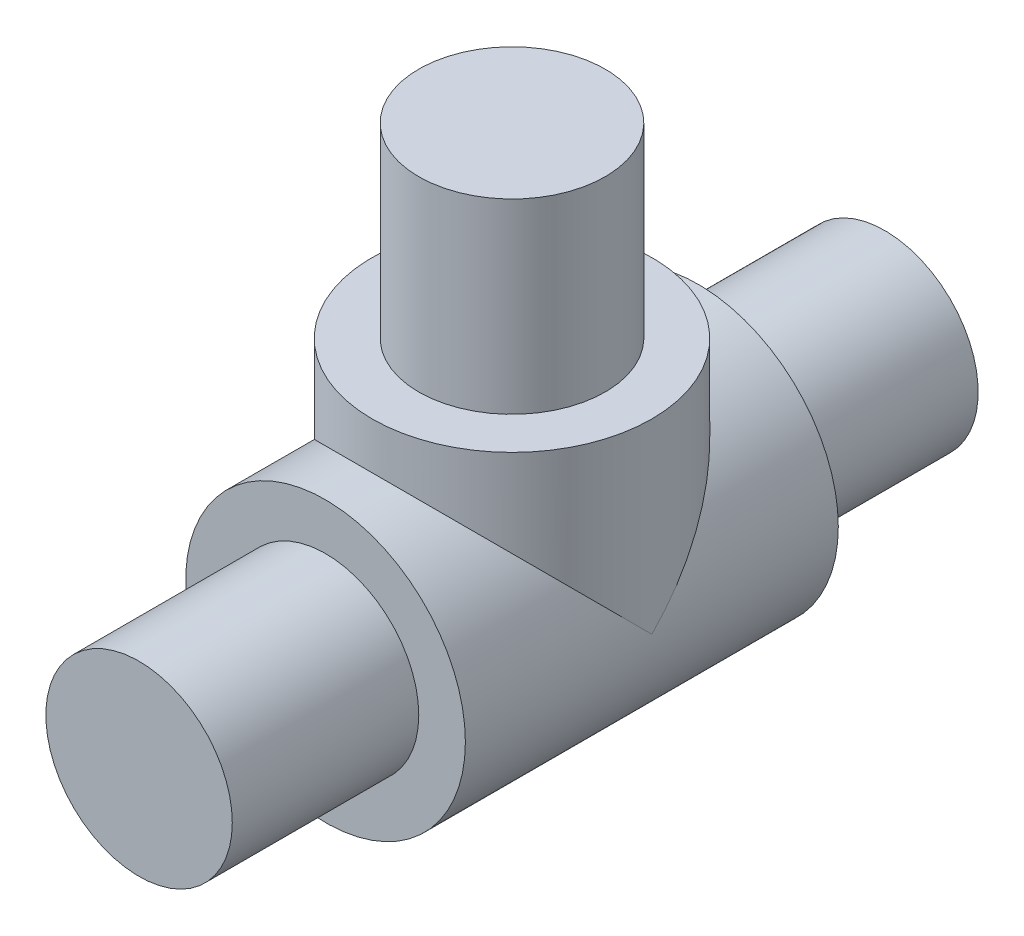
ISO-10303-21;
HEADER;
FILE_DESCRIPTION(('STEP AP214'),'2;1');
FILE_NAME('part.step','',(''),(''),'','','');
FILE_SCHEMA(('AUTOMOTIVE_DESIGN { 1 0 10303 214 1 1 1 1 }'));
ENDSEC;
DATA;
#1=APPLICATION_CONTEXT('core data for automotive mechanical design processes');
#2=APPLICATION_PROTOCOL_DEFINITION('international standard','automotive_design',2000,#1);
#3=PRODUCT_CONTEXT('',#1,'mechanical');
#4=PRODUCT('Part','Part','',(#3));
#5=PRODUCT_RELATED_PRODUCT_CATEGORY('part','',(#4));
#6=PRODUCT_DEFINITION_FORMATION('','',#4);
#7=PRODUCT_DEFINITION_CONTEXT('part definition',#1,'design');
#8=PRODUCT_DEFINITION('design','',#6,#7);
#9=PRODUCT_DEFINITION_SHAPE('','',#8);
#10=(LENGTH_UNIT() NAMED_UNIT(*) SI_UNIT(.MILLI.,.METRE.));
#11=(NAMED_UNIT(*) PLANE_ANGLE_UNIT() SI_UNIT($,.RADIAN.));
#12=(NAMED_UNIT(*) SI_UNIT($,.STERADIAN.) SOLID_ANGLE_UNIT());
#13=UNCERTAINTY_MEASURE_WITH_UNIT(LENGTH_MEASURE(1.E-05),#10,'distance_accuracy_value','');
#14=(GEOMETRIC_REPRESENTATION_CONTEXT(3) GLOBAL_UNCERTAINTY_ASSIGNED_CONTEXT((#13)) GLOBAL_UNIT_ASSIGNED_CONTEXT((#10,
#11,#12)) REPRESENTATION_CONTEXT('',''));
#15=CARTESIAN_POINT('',(0.,0.,0.));
#16=DIRECTION('',(0.,0.,1.));
#17=DIRECTION('',(1.,0.,0.));
#18=AXIS2_PLACEMENT_3D('',#15,#16,#17);
#19=CARTESIAN_POINT('',(0.,0.,10.16));
#20=DIRECTION('',(0.,0.,-1.));
#21=DIRECTION('',(-1.,0.,0.));
#22=AXIS2_PLACEMENT_3D('',#19,#20,#21);
#23=CYLINDRICAL_SURFACE('',#22,3.81);
#24=CARTESIAN_POINT('',(0.,0.,0.));
#25=DIRECTION('',(0.,0.,1.));
#26=DIRECTION('',(1.,0.,0.));
#27=AXIS2_PLACEMENT_3D('',#24,#25,#26);
#28=CIRCLE('',#27,3.81);
#29=CARTESIAN_POINT('',(3.81,0.,0.));
#30=VERTEX_POINT('',#29);
#31=EDGE_CURVE('E66',#30,#30,#28,.T.);
#32=ORIENTED_EDGE('',*,*,#31,.T.);
#33=EDGE_LOOP('',(#32));
#34=FACE_BOUND('',#33,.T.);
#35=CARTESIAN_POINT('',(0.,0.,10.16));
#36=DIRECTION('',(0.,0.,1.));
#37=DIRECTION('',(1.,0.,0.));
#38=AXIS2_PLACEMENT_3D('',#35,#36,#37);
#39=CIRCLE('',#38,3.81);
#40=CARTESIAN_POINT('',(3.81,0.,10.16));
#41=VERTEX_POINT('',#40);
#42=EDGE_CURVE('E70',#41,#41,#39,.T.);
#43=ORIENTED_EDGE('',*,*,#42,.F.);
#44=EDGE_LOOP('',(#43));
#45=FACE_BOUND('',#44,.T.);
#46=CARTESIAN_POINT('',(0.,0.,5.08));
#47=DIRECTION('',(0.,-0.707106781186547,-0.707106781186547));
#48=DIRECTION('',(0.,0.707106781186547,-0.707106781186547));
#49=AXIS2_PLACEMENT_3D('',#46,#47,#48);
#50=ELLIPSE('',#49,5.38815367264149,3.81);
#51=CARTESIAN_POINT('',(3.81,0.,5.08));
#52=VERTEX_POINT('',#51);
#53=CARTESIAN_POINT('',(-3.81,0.,5.08));
#54=VERTEX_POINT('',#53);
#55=EDGE_CURVE('E42',#52,#54,#50,.F.);
#56=ORIENTED_EDGE('',*,*,#55,.F.);
#57=CARTESIAN_POINT('',(0.,0.,5.08));
#58=DIRECTION('',(0.,0.707106781186547,-0.707106781186547));
#59=DIRECTION('',(0.,-0.707106781186547,-0.707106781186547));
#60=AXIS2_PLACEMENT_3D('',#57,#58,#59);
#61=ELLIPSE('',#60,5.38815367264149,3.81);
#62=EDGE_CURVE('E54',#54,#52,#61,.T.);
#63=ORIENTED_EDGE('',*,*,#62,.F.);
#64=EDGE_LOOP('',(#56,#63));
#65=FACE_BOUND('',#64,.T.);
#66=ADVANCED_FACE('F39',(#34,#45,#65),#23,.T.);
#67=CARTESIAN_POINT('',(0.,0.,10.16));
#68=DIRECTION('',(0.,0.,1.));
#69=DIRECTION('',(1.,0.,0.));
#70=AXIS2_PLACEMENT_3D('',#67,#68,#69);
#71=PLANE('',#70);
#72=CARTESIAN_POINT('',(0.,0.,10.16));
#73=DIRECTION('',(0.,0.,1.));
#74=DIRECTION('',(1.,0.,0.));
#75=AXIS2_PLACEMENT_3D('',#72,#73,#74);
#76=CIRCLE('',#75,2.54);
#77=CARTESIAN_POINT('',(2.54,0.,10.16));
#78=VERTEX_POINT('',#77);
#79=EDGE_CURVE('E63',#78,#78,#76,.T.);
#80=ORIENTED_EDGE('',*,*,#79,.F.);
#81=EDGE_LOOP('',(#80));
#82=FACE_BOUND('',#81,.T.);
#83=ORIENTED_EDGE('',*,*,#42,.T.);
#84=EDGE_LOOP('',(#83));
#85=FACE_BOUND('',#84,.T.);
#86=ADVANCED_FACE('F119',(#82,#85),#71,.T.);
#87=CARTESIAN_POINT('',(0.,0.,0.));
#88=DIRECTION('',(0.,0.,1.));
#89=DIRECTION('',(1.,0.,0.));
#90=AXIS2_PLACEMENT_3D('',#87,#88,#89);
#91=PLANE('',#90);
#92=CARTESIAN_POINT('',(0.,0.,0.));
#93=DIRECTION('',(0.,0.,-1.));
#94=DIRECTION('',(-1.,0.,0.));
#95=AXIS2_PLACEMENT_3D('',#92,#93,#94);
#96=CIRCLE('',#95,2.54);
#97=CARTESIAN_POINT('',(-2.54,0.,0.));
#98=VERTEX_POINT('',#97);
#99=EDGE_CURVE('E60',#98,#98,#96,.T.);
#100=ORIENTED_EDGE('',*,*,#99,.F.);
#101=EDGE_LOOP('',(#100));
#102=FACE_BOUND('',#101,.T.);
#103=ORIENTED_EDGE('',*,*,#31,.F.);
#104=EDGE_LOOP('',(#103));
#105=FACE_BOUND('',#104,.T.);
#106=ADVANCED_FACE('F125',(#102,#105),#91,.F.);
#107=CARTESIAN_POINT('',(0.,0.,15.24));
#108=DIRECTION('',(0.,0.,-1.));
#109=DIRECTION('',(-1.,0.,0.));
#110=AXIS2_PLACEMENT_3D('',#107,#108,#109);
#111=CYLINDRICAL_SURFACE('',#110,2.54);
#112=CARTESIAN_POINT('',(0.,0.,15.24));
#113=DIRECTION('',(0.,0.,1.));
#114=DIRECTION('',(1.,0.,0.));
#115=AXIS2_PLACEMENT_3D('',#112,#113,#114);
#116=CIRCLE('',#115,2.54);
#117=CARTESIAN_POINT('',(2.54,0.,15.24));
#118=VERTEX_POINT('',#117);
#119=EDGE_CURVE('E71',#118,#118,#116,.T.);
#120=ORIENTED_EDGE('',*,*,#119,.F.);
#121=EDGE_LOOP('',(#120));
#122=FACE_BOUND('',#121,.T.);
#123=ORIENTED_EDGE('',*,*,#79,.T.);
#124=EDGE_LOOP('',(#123));
#125=FACE_BOUND('',#124,.T.);
#126=ADVANCED_FACE('F134',(#122,#125),#111,.T.);
#127=CARTESIAN_POINT('',(0.,0.,15.24));
#128=DIRECTION('',(0.,0.,1.));
#129=DIRECTION('',(1.,0.,0.));
#130=AXIS2_PLACEMENT_3D('',#127,#128,#129);
#131=PLANE('',#130);
#132=ORIENTED_EDGE('',*,*,#119,.T.);
#133=EDGE_LOOP('',(#132));
#134=FACE_BOUND('',#133,.T.);
#135=ADVANCED_FACE('F139',(#134),#131,.T.);
#136=CARTESIAN_POINT('',(0.,0.,-5.08));
#137=DIRECTION('',(0.,0.,1.));
#138=DIRECTION('',(1.,0.,0.));
#139=AXIS2_PLACEMENT_3D('',#136,#137,#138);
#140=CYLINDRICAL_SURFACE('',#139,2.54);
#141=CARTESIAN_POINT('',(0.,0.,-5.08));
#142=DIRECTION('',(0.,0.,-1.));
#143=DIRECTION('',(-1.,0.,0.));
#144=AXIS2_PLACEMENT_3D('',#141,#142,#143);
#145=CIRCLE('',#144,2.54);
#146=CARTESIAN_POINT('',(-2.54,0.,-5.08));
#147=VERTEX_POINT('',#146);
#148=EDGE_CURVE('E80',#147,#147,#145,.T.);
#149=ORIENTED_EDGE('',*,*,#148,.F.);
#150=EDGE_LOOP('',(#149));
#151=FACE_BOUND('',#150,.T.);
#152=ORIENTED_EDGE('',*,*,#99,.T.);
#153=EDGE_LOOP('',(#152));
#154=FACE_BOUND('',#153,.T.);
#155=ADVANCED_FACE('F115',(#151,#154),#140,.T.);
#156=CARTESIAN_POINT('',(0.,0.,-5.08));
#157=DIRECTION('',(0.,0.,-1.));
#158=DIRECTION('',(-1.,0.,0.));
#159=AXIS2_PLACEMENT_3D('',#156,#157,#158);
#160=PLANE('',#159);
#161=ORIENTED_EDGE('',*,*,#148,.T.);
#162=EDGE_LOOP('',(#161));
#163=FACE_BOUND('',#162,.T.);
#164=ADVANCED_FACE('F109',(#163),#160,.T.);
#165=CARTESIAN_POINT('',(0.,5.08,5.08));
#166=DIRECTION('',(0.,-1.,0.));
#167=DIRECTION('',(0.,0.,-1.));
#168=AXIS2_PLACEMENT_3D('',#165,#166,#167);
#169=CYLINDRICAL_SURFACE('',#168,3.81);
#170=CARTESIAN_POINT('',(0.,5.08,5.08));
#171=DIRECTION('',(0.,1.,0.));
#172=DIRECTION('',(0.,0.,1.));
#173=AXIS2_PLACEMENT_3D('',#170,#171,#172);
#174=CIRCLE('',#173,3.81);
#175=CARTESIAN_POINT('',(0.,5.08,8.89));
#176=VERTEX_POINT('',#175);
#177=EDGE_CURVE('E85',#176,#176,#174,.T.);
#178=ORIENTED_EDGE('',*,*,#177,.F.);
#179=EDGE_LOOP('',(#178));
#180=FACE_BOUND('',#179,.T.);
#181=ORIENTED_EDGE('',*,*,#62,.T.);
#182=ORIENTED_EDGE('',*,*,#55,.T.);
#183=EDGE_LOOP('',(#181,#182));
#184=FACE_BOUND('',#183,.T.);
#185=ADVANCED_FACE('F58',(#180,#184),#169,.T.);
#186=CARTESIAN_POINT('',(0.,5.08,5.08));
#187=DIRECTION('',(0.,1.,0.));
#188=DIRECTION('',(0.,0.,1.));
#189=AXIS2_PLACEMENT_3D('',#186,#187,#188);
#190=PLANE('',#189);
#191=CARTESIAN_POINT('',(0.,5.08,5.08));
#192=DIRECTION('',(0.,1.,0.));
#193=DIRECTION('',(0.,0.,1.));
#194=AXIS2_PLACEMENT_3D('',#191,#192,#193);
#195=CIRCLE('',#194,2.54);
#196=CARTESIAN_POINT('',(0.,5.08,7.62));
#197=VERTEX_POINT('',#196);
#198=EDGE_CURVE('E11',#197,#197,#195,.T.);
#199=ORIENTED_EDGE('',*,*,#198,.F.);
#200=EDGE_LOOP('',(#199));
#201=FACE_BOUND('',#200,.T.);
#202=ORIENTED_EDGE('',*,*,#177,.T.);
#203=EDGE_LOOP('',(#202));
#204=FACE_BOUND('',#203,.T.);
#205=ADVANCED_FACE('F99',(#201,#204),#190,.T.);
#206=CARTESIAN_POINT('',(0.,10.16,5.08));
#207=DIRECTION('',(0.,-1.,0.));
#208=DIRECTION('',(0.,0.,-1.));
#209=AXIS2_PLACEMENT_3D('',#206,#207,#208);
#210=CYLINDRICAL_SURFACE('',#209,2.54);
#211=CARTESIAN_POINT('',(0.,10.16,5.08));
#212=DIRECTION('',(0.,1.,0.));
#213=DIRECTION('',(0.,0.,1.));
#214=AXIS2_PLACEMENT_3D('',#211,#212,#213);
#215=CIRCLE('',#214,2.54);
#216=CARTESIAN_POINT('',(0.,10.16,7.62));
#217=VERTEX_POINT('',#216);
#218=EDGE_CURVE('E88',#217,#217,#215,.T.);
#219=ORIENTED_EDGE('',*,*,#218,.F.);
#220=EDGE_LOOP('',(#219));
#221=FACE_BOUND('',#220,.T.);
#222=ORIENTED_EDGE('',*,*,#198,.T.);
#223=EDGE_LOOP('',(#222));
#224=FACE_BOUND('',#223,.T.);
#225=ADVANCED_FACE('F96',(#221,#224),#210,.T.);
#226=CARTESIAN_POINT('',(0.,10.16,5.08));
#227=DIRECTION('',(0.,1.,0.));
#228=DIRECTION('',(0.,0.,1.));
#229=AXIS2_PLACEMENT_3D('',#226,#227,#228);
#230=PLANE('',#229);
#231=ORIENTED_EDGE('',*,*,#218,.T.);
#232=EDGE_LOOP('',(#231));
#233=FACE_BOUND('',#232,.T.);
#234=ADVANCED_FACE('F94',(#233),#230,.T.);
#235=CLOSED_SHELL('',(#66,#86,#106,#126,#135,#155,#164,#185,#205,#225,#234));
#236=MANIFOLD_SOLID_BREP('B2',#235);
#237=ADVANCED_BREP_SHAPE_REPRESENTATION('',(#18,#236),#14);
#238=SHAPE_DEFINITION_REPRESENTATION(#9,#237);
ENDSEC;
END-ISO-10303-21;
